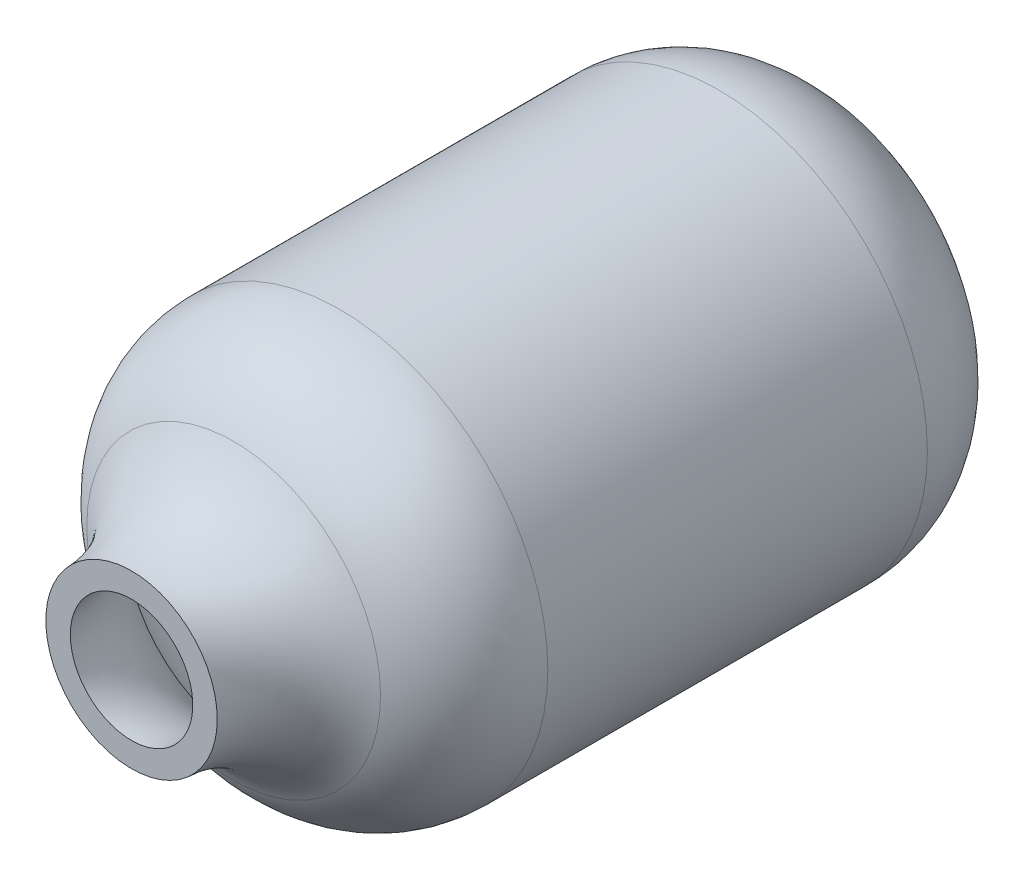
ISO-10303-21;
HEADER;
FILE_DESCRIPTION(('STEP AP214'),'2;1');
FILE_NAME('part.step','',(''),(''),'','','');
FILE_SCHEMA(('AUTOMOTIVE_DESIGN { 1 0 10303 214 1 1 1 1 }'));
ENDSEC;
DATA;
#1=APPLICATION_CONTEXT('core data for automotive mechanical design processes');
#2=APPLICATION_PROTOCOL_DEFINITION('international standard','automotive_design',2000,#1);
#3=PRODUCT_CONTEXT('',#1,'mechanical');
#4=PRODUCT('Part','Part','',(#3));
#5=PRODUCT_RELATED_PRODUCT_CATEGORY('part','',(#4));
#6=PRODUCT_DEFINITION_FORMATION('','',#4);
#7=PRODUCT_DEFINITION_CONTEXT('part definition',#1,'design');
#8=PRODUCT_DEFINITION('design','',#6,#7);
#9=PRODUCT_DEFINITION_SHAPE('','',#8);
#10=(LENGTH_UNIT() NAMED_UNIT(*) SI_UNIT(.MILLI.,.METRE.));
#11=(NAMED_UNIT(*) PLANE_ANGLE_UNIT() SI_UNIT($,.RADIAN.));
#12=(NAMED_UNIT(*) SI_UNIT($,.STERADIAN.) SOLID_ANGLE_UNIT());
#13=UNCERTAINTY_MEASURE_WITH_UNIT(LENGTH_MEASURE(1.E-05),#10,'distance_accuracy_value','');
#14=(GEOMETRIC_REPRESENTATION_CONTEXT(3) GLOBAL_UNCERTAINTY_ASSIGNED_CONTEXT((#13)) GLOBAL_UNIT_ASSIGNED_CONTEXT((#10,
#11,#12)) REPRESENTATION_CONTEXT('',''));
#15=CARTESIAN_POINT('',(0.,0.,0.));
#16=DIRECTION('',(0.,0.,1.));
#17=DIRECTION('',(1.,0.,0.));
#18=AXIS2_PLACEMENT_3D('',#15,#16,#17);
#19=CARTESIAN_POINT('',(0.,0.,51.));
#20=DIRECTION('',(0.,0.,-1.));
#21=DIRECTION('',(-1.,0.,0.));
#22=AXIS2_PLACEMENT_3D('',#19,#20,#21);
#23=CYLINDRICAL_SURFACE('',#22,17.);
#24=CARTESIAN_POINT('',(0.,0.,41.));
#25=DIRECTION('',(0.,0.,1.));
#26=DIRECTION('',(1.,0.,0.));
#27=AXIS2_PLACEMENT_3D('',#24,#25,#26);
#28=CIRCLE('',#27,17.);
#29=CARTESIAN_POINT('',(17.,0.,41.));
#30=VERTEX_POINT('',#29);
#31=EDGE_CURVE('E51',#30,#30,#28,.F.);
#32=ORIENTED_EDGE('',*,*,#31,.T.);
#33=EDGE_LOOP('',(#32));
#34=FACE_BOUND('',#33,.T.);
#35=CARTESIAN_POINT('',(0.,0.,10.));
#36=DIRECTION('',(0.,0.,1.));
#37=DIRECTION('',(1.,0.,0.));
#38=AXIS2_PLACEMENT_3D('',#35,#36,#37);
#39=CIRCLE('',#38,17.);
#40=CARTESIAN_POINT('',(17.,0.,10.));
#41=VERTEX_POINT('',#40);
#42=EDGE_CURVE('E61',#41,#41,#39,.T.);
#43=ORIENTED_EDGE('',*,*,#42,.T.);
#44=EDGE_LOOP('',(#43));
#45=FACE_BOUND('',#44,.T.);
#46=ADVANCED_FACE('F43',(#34,#45),#23,.T.);
#47=CARTESIAN_POINT('',(0.,0.,0.));
#48=DIRECTION('',(0.,0.,1.));
#49=DIRECTION('',(1.,0.,0.));
#50=AXIS2_PLACEMENT_3D('',#47,#48,#49);
#51=PLANE('',#50);
#52=CARTESIAN_POINT('',(0.,0.,0.));
#53=DIRECTION('',(0.,0.,1.));
#54=DIRECTION('',(1.,0.,0.));
#55=AXIS2_PLACEMENT_3D('',#52,#53,#54);
#56=CIRCLE('',#55,7.);
#57=CARTESIAN_POINT('',(7.,0.,0.));
#58=VERTEX_POINT('',#57);
#59=EDGE_CURVE('E56',#58,#58,#56,.F.);
#60=ORIENTED_EDGE('',*,*,#59,.T.);
#61=EDGE_LOOP('',(#60));
#62=FACE_BOUND('',#61,.T.);
#63=ADVANCED_FACE('F115',(#62),#51,.F.);
#64=CARTESIAN_POINT('',(0.,0.,10.));
#65=DIRECTION('',(0.,0.,1.));
#66=DIRECTION('',(1.,0.,0.));
#67=AXIS2_PLACEMENT_3D('',#64,#65,#66);
#68=DEGENERATE_TOROIDAL_SURFACE('',#67,7.,10.,.T.);
#69=ORIENTED_EDGE('',*,*,#59,.F.);
#70=EDGE_LOOP('',(#69));
#71=FACE_BOUND('',#70,.T.);
#72=ORIENTED_EDGE('',*,*,#42,.F.);
#73=EDGE_LOOP('',(#72));
#74=FACE_BOUND('',#73,.T.);
#75=ADVANCED_FACE('F122',(#71,#74),#68,.T.);
#76=CARTESIAN_POINT('',(0.,0.,41.));
#77=DIRECTION('',(0.,0.,1.));
#78=DIRECTION('',(1.,0.,0.));
#79=AXIS2_PLACEMENT_3D('',#76,#77,#78);
#80=DEGENERATE_TOROIDAL_SURFACE('',#79,7.,10.,.T.);
#81=CARTESIAN_POINT('',(0.,0.,49.6617647058824));
#82=DIRECTION('',(0.,0.,-1.));
#83=DIRECTION('',(-1.,0.,0.));
#84=AXIS2_PLACEMENT_3D('',#81,#82,#83);
#85=CIRCLE('',#84,11.9973825328797);
#86=CARTESIAN_POINT('',(-11.9973825328797,0.,49.6617647058824));
#87=VERTEX_POINT('',#86);
#88=EDGE_CURVE('E10',#87,#87,#85,.T.);
#89=ORIENTED_EDGE('',*,*,#88,.T.);
#90=EDGE_LOOP('',(#89));
#91=FACE_BOUND('',#90,.T.);
#92=ORIENTED_EDGE('',*,*,#31,.F.);
#93=EDGE_LOOP('',(#92));
#94=FACE_BOUND('',#93,.T.);
#95=ADVANCED_FACE('F128',(#91,#94),#80,.T.);
#96=CARTESIAN_POINT('',(0.,0.,58.));
#97=DIRECTION('',(0.,0.,1.));
#98=DIRECTION('',(1.,0.,0.));
#99=AXIS2_PLACEMENT_3D('',#96,#97,#98);
#100=PLANE('',#99);
#101=CARTESIAN_POINT('',(0.,0.,58.));
#102=DIRECTION('',(0.,0.,-1.));
#103=DIRECTION('',(-1.,0.,0.));
#104=AXIS2_PLACEMENT_3D('',#101,#102,#103);
#105=CIRCLE('',#104,4.99912716193266);
#106=CARTESIAN_POINT('',(-4.99912716193266,0.,58.));
#107=VERTEX_POINT('',#106);
#108=EDGE_CURVE('E72',#107,#107,#105,.F.);
#109=ORIENTED_EDGE('',*,*,#108,.F.);
#110=EDGE_LOOP('',(#109));
#111=FACE_BOUND('',#110,.T.);
#112=CARTESIAN_POINT('',(0.,0.,58.));
#113=DIRECTION('',(0.,0.,1.));
#114=DIRECTION('',(1.,0.,0.));
#115=AXIS2_PLACEMENT_3D('',#112,#113,#114);
#116=CIRCLE('',#115,7.);
#117=CARTESIAN_POINT('',(7.,0.,58.));
#118=VERTEX_POINT('',#117);
#119=EDGE_CURVE('E67',#118,#118,#116,.T.);
#120=ORIENTED_EDGE('',*,*,#119,.T.);
#121=EDGE_LOOP('',(#120));
#122=FACE_BOUND('',#121,.T.);
#123=ADVANCED_FACE('F130',(#111,#122),#100,.T.);
#124=CARTESIAN_POINT('',(0.,0.,58.3235294117647));
#125=DIRECTION('',(0.,0.,-1.));
#126=DIRECTION('',(-1.,0.,0.));
#127=AXIS2_PLACEMENT_3D('',#124,#125,#126);
#128=TOROIDAL_SURFACE('',#127,16.9947650657593,10.);
#129=ORIENTED_EDGE('',*,*,#88,.F.);
#130=EDGE_LOOP('',(#129));
#131=FACE_BOUND('',#130,.T.);
#132=ORIENTED_EDGE('',*,*,#119,.F.);
#133=EDGE_LOOP('',(#132));
#134=FACE_BOUND('',#133,.T.);
#135=ADVANCED_FACE('F45',(#131,#134),#128,.F.);
#136=CARTESIAN_POINT('',(0.,0.,51.));
#137=DIRECTION('',(0.,0.,-1.));
#138=DIRECTION('',(-1.,0.,0.));
#139=AXIS2_PLACEMENT_3D('',#136,#137,#138);
#140=CYLINDRICAL_SURFACE('',#139,15.);
#141=CARTESIAN_POINT('',(0.,0.,41.));
#142=DIRECTION('',(0.,0.,-1.));
#143=DIRECTION('',(-1.,0.,0.));
#144=AXIS2_PLACEMENT_3D('',#141,#142,#143);
#145=CIRCLE('',#144,15.);
#146=CARTESIAN_POINT('',(-15.,0.,41.));
#147=VERTEX_POINT('',#146);
#148=EDGE_CURVE('E80',#147,#147,#145,.T.);
#149=ORIENTED_EDGE('',*,*,#148,.F.);
#150=EDGE_LOOP('',(#149));
#151=FACE_BOUND('',#150,.T.);
#152=CARTESIAN_POINT('',(0.,0.,10.));
#153=DIRECTION('',(0.,0.,-1.));
#154=DIRECTION('',(-1.,0.,0.));
#155=AXIS2_PLACEMENT_3D('',#152,#153,#154);
#156=CIRCLE('',#155,15.);
#157=CARTESIAN_POINT('',(-15.,0.,10.));
#158=VERTEX_POINT('',#157);
#159=EDGE_CURVE('E76',#158,#158,#156,.F.);
#160=ORIENTED_EDGE('',*,*,#159,.F.);
#161=EDGE_LOOP('',(#160));
#162=FACE_BOUND('',#161,.T.);
#163=ADVANCED_FACE('F94',(#151,#162),#140,.F.);
#164=CARTESIAN_POINT('',(0.,0.,2.));
#165=DIRECTION('',(0.,0.,1.));
#166=DIRECTION('',(1.,0.,0.));
#167=AXIS2_PLACEMENT_3D('',#164,#165,#166);
#168=PLANE('',#167);
#169=CARTESIAN_POINT('',(0.,0.,2.));
#170=DIRECTION('',(0.,0.,1.));
#171=DIRECTION('',(1.,0.,0.));
#172=AXIS2_PLACEMENT_3D('',#169,#170,#171);
#173=CIRCLE('',#172,7.);
#174=CARTESIAN_POINT('',(7.,0.,2.));
#175=VERTEX_POINT('',#174);
#176=EDGE_CURVE('E81',#175,#175,#173,.F.);
#177=ORIENTED_EDGE('',*,*,#176,.F.);
#178=EDGE_LOOP('',(#177));
#179=FACE_BOUND('',#178,.T.);
#180=ADVANCED_FACE('F97',(#179),#168,.T.);
#181=CARTESIAN_POINT('',(0.,0.,10.));
#182=DIRECTION('',(0.,0.,1.));
#183=DIRECTION('',(1.,0.,0.));
#184=AXIS2_PLACEMENT_3D('',#181,#182,#183);
#185=DEGENERATE_TOROIDAL_SURFACE('',#184,7.,8.,.T.);
#186=ORIENTED_EDGE('',*,*,#176,.T.);
#187=EDGE_LOOP('',(#186));
#188=FACE_BOUND('',#187,.T.);
#189=ORIENTED_EDGE('',*,*,#159,.T.);
#190=EDGE_LOOP('',(#189));
#191=FACE_BOUND('',#190,.T.);
#192=ADVANCED_FACE('F101',(#188,#191),#185,.F.);
#193=CARTESIAN_POINT('',(0.,0.,41.));
#194=DIRECTION('',(0.,0.,1.));
#195=DIRECTION('',(1.,0.,0.));
#196=AXIS2_PLACEMENT_3D('',#193,#194,#195);
#197=DEGENERATE_TOROIDAL_SURFACE('',#196,7.,8.,.T.);
#198=CARTESIAN_POINT('',(0.,0.,47.9294117647059));
#199=DIRECTION('',(0.,0.,1.));
#200=DIRECTION('',(1.,0.,0.));
#201=AXIS2_PLACEMENT_3D('',#198,#199,#200);
#202=CIRCLE('',#201,10.9979060263037);
#203=CARTESIAN_POINT('',(10.9979060263037,0.,47.9294117647059));
#204=VERTEX_POINT('',#203);
#205=EDGE_CURVE('E71',#204,#204,#202,.F.);
#206=ORIENTED_EDGE('',*,*,#205,.F.);
#207=EDGE_LOOP('',(#206));
#208=FACE_BOUND('',#207,.T.);
#209=ORIENTED_EDGE('',*,*,#148,.T.);
#210=EDGE_LOOP('',(#209));
#211=FACE_BOUND('',#210,.T.);
#212=ADVANCED_FACE('F92',(#208,#211),#197,.F.);
#213=CARTESIAN_POINT('',(0.,0.,58.3235294117647));
#214=DIRECTION('',(0.,0.,-1.));
#215=DIRECTION('',(-1.,0.,0.));
#216=AXIS2_PLACEMENT_3D('',#213,#214,#215);
#217=TOROIDAL_SURFACE('',#216,16.9947650657593,12.);
#218=ORIENTED_EDGE('',*,*,#205,.T.);
#219=EDGE_LOOP('',(#218));
#220=FACE_BOUND('',#219,.T.);
#221=ORIENTED_EDGE('',*,*,#108,.T.);
#222=EDGE_LOOP('',(#221));
#223=FACE_BOUND('',#222,.T.);
#224=ADVANCED_FACE('F109',(#220,#223),#217,.T.);
#225=CLOSED_SHELL('',(#46,#63,#75,#95,#123,#135,#163,#180,#192,#212,#224));
#226=MANIFOLD_SOLID_BREP('B2',#225);
#227=ADVANCED_BREP_SHAPE_REPRESENTATION('',(#18,#226),#14);
#228=SHAPE_DEFINITION_REPRESENTATION(#9,#227);
ENDSEC;
END-ISO-10303-21;
